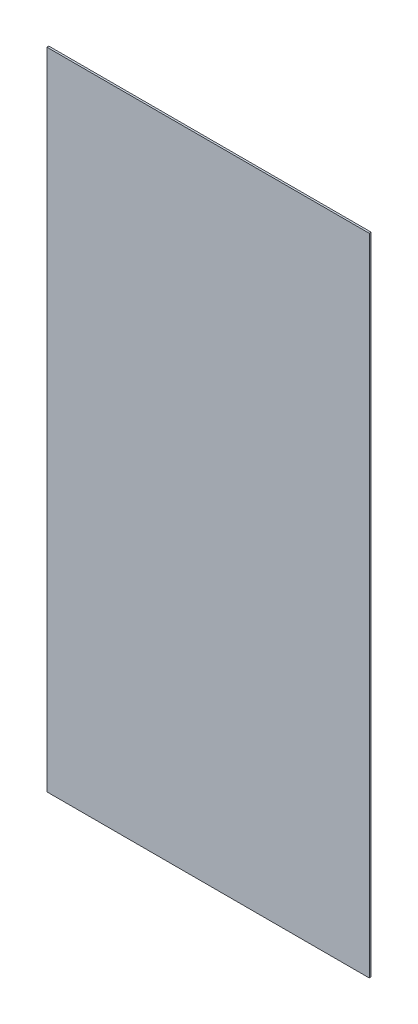
ISO-10303-21;
HEADER;
FILE_DESCRIPTION(('STEP AP214'),'2;1');
FILE_NAME('part.step','',(''),(''),'','','');
FILE_SCHEMA(('AUTOMOTIVE_DESIGN { 1 0 10303 214 1 1 1 1 }'));
ENDSEC;
DATA;
#1=APPLICATION_CONTEXT('core data for automotive mechanical design processes');
#2=APPLICATION_PROTOCOL_DEFINITION('international standard','automotive_design',2000,#1);
#3=PRODUCT_CONTEXT('',#1,'mechanical');
#4=PRODUCT('Part','Part','',(#3));
#5=PRODUCT_RELATED_PRODUCT_CATEGORY('part','',(#4));
#6=PRODUCT_DEFINITION_FORMATION('','',#4);
#7=PRODUCT_DEFINITION_CONTEXT('part definition',#1,'design');
#8=PRODUCT_DEFINITION('design','',#6,#7);
#9=PRODUCT_DEFINITION_SHAPE('','',#8);
#10=(LENGTH_UNIT() NAMED_UNIT(*) SI_UNIT(.MILLI.,.METRE.));
#11=(NAMED_UNIT(*) PLANE_ANGLE_UNIT() SI_UNIT($,.RADIAN.));
#12=(NAMED_UNIT(*) SI_UNIT($,.STERADIAN.) SOLID_ANGLE_UNIT());
#13=UNCERTAINTY_MEASURE_WITH_UNIT(LENGTH_MEASURE(1.E-05),#10,'distance_accuracy_value','');
#14=(GEOMETRIC_REPRESENTATION_CONTEXT(3) GLOBAL_UNCERTAINTY_ASSIGNED_CONTEXT((#13)) GLOBAL_UNIT_ASSIGNED_CONTEXT((#10,
#11,#12)) REPRESENTATION_CONTEXT('',''));
#15=CARTESIAN_POINT('',(0.,0.,0.));
#16=DIRECTION('',(0.,0.,1.));
#17=DIRECTION('',(1.,0.,0.));
#18=AXIS2_PLACEMENT_3D('',#15,#16,#17);
#19=CARTESIAN_POINT('',(250.,500.,3.));
#20=DIRECTION('',(-1.,0.,0.));
#21=DIRECTION('',(0.,-1.,0.));
#22=AXIS2_PLACEMENT_3D('',#19,#20,#21);
#23=PLANE('',#22);
#24=DIRECTION('',(0.,1.,0.));
#25=VECTOR('',#24,1.);
#26=CARTESIAN_POINT('',(250.,500.,0.));
#27=LINE('',#26,#25);
#28=CARTESIAN_POINT('',(250.,-500.,0.));
#29=VERTEX_POINT('',#28);
#30=CARTESIAN_POINT('',(250.,500.,0.));
#31=VERTEX_POINT('',#30);
#32=EDGE_CURVE('E106',#29,#31,#27,.T.);
#33=ORIENTED_EDGE('',*,*,#32,.T.);
#34=DIRECTION('',(0.,0.,-1.));
#35=VECTOR('',#34,1.);
#36=CARTESIAN_POINT('',(250.,500.,3.));
#37=LINE('',#36,#35);
#38=CARTESIAN_POINT('',(250.,500.,3.));
#39=VERTEX_POINT('',#38);
#40=EDGE_CURVE('E11',#39,#31,#37,.T.);
#41=ORIENTED_EDGE('',*,*,#40,.F.);
#42=DIRECTION('',(0.,1.,0.));
#43=VECTOR('',#42,1.);
#44=CARTESIAN_POINT('',(250.,500.,3.));
#45=LINE('',#44,#43);
#46=CARTESIAN_POINT('',(250.,-500.,3.));
#47=VERTEX_POINT('',#46);
#48=EDGE_CURVE('E94',#47,#39,#45,.T.);
#49=ORIENTED_EDGE('',*,*,#48,.F.);
#50=DIRECTION('',(0.,0.,-1.));
#51=VECTOR('',#50,1.);
#52=CARTESIAN_POINT('',(250.,-500.,3.));
#53=LINE('',#52,#51);
#54=EDGE_CURVE('E102',#47,#29,#53,.T.);
#55=ORIENTED_EDGE('',*,*,#54,.T.);
#56=EDGE_LOOP('',(#33,#41,#49,#55));
#57=FACE_BOUND('',#56,.T.);
#58=ADVANCED_FACE('F43',(#57),#23,.F.);
#59=CARTESIAN_POINT('',(-250.,500.,3.));
#60=DIRECTION('',(0.,-1.,0.));
#61=DIRECTION('',(1.,0.,0.));
#62=AXIS2_PLACEMENT_3D('',#59,#60,#61);
#63=PLANE('',#62);
#64=DIRECTION('',(-1.,0.,0.));
#65=VECTOR('',#64,1.);
#66=CARTESIAN_POINT('',(-250.,500.,0.));
#67=LINE('',#66,#65);
#68=CARTESIAN_POINT('',(-250.,500.,0.));
#69=VERTEX_POINT('',#68);
#70=EDGE_CURVE('E98',#31,#69,#67,.T.);
#71=ORIENTED_EDGE('',*,*,#70,.T.);
#72=DIRECTION('',(0.,0.,-1.));
#73=VECTOR('',#72,1.);
#74=CARTESIAN_POINT('',(-250.,500.,3.));
#75=LINE('',#74,#73);
#76=CARTESIAN_POINT('',(-250.,500.,3.));
#77=VERTEX_POINT('',#76);
#78=EDGE_CURVE('E51',#77,#69,#75,.T.);
#79=ORIENTED_EDGE('',*,*,#78,.F.);
#80=DIRECTION('',(-1.,0.,0.));
#81=VECTOR('',#80,1.);
#82=CARTESIAN_POINT('',(-250.,500.,3.));
#83=LINE('',#82,#81);
#84=EDGE_CURVE('E89',#39,#77,#83,.T.);
#85=ORIENTED_EDGE('',*,*,#84,.F.);
#86=ORIENTED_EDGE('',*,*,#40,.T.);
#87=EDGE_LOOP('',(#71,#79,#85,#86));
#88=FACE_BOUND('',#87,.T.);
#89=ADVANCED_FACE('F97',(#88),#63,.F.);
#90=CARTESIAN_POINT('',(-250.,500.,3.));
#91=DIRECTION('',(1.,0.,0.));
#92=DIRECTION('',(0.,1.,0.));
#93=AXIS2_PLACEMENT_3D('',#90,#91,#92);
#94=PLANE('',#93);
#95=DIRECTION('',(0.,-1.,0.));
#96=VECTOR('',#95,1.);
#97=CARTESIAN_POINT('',(-250.,500.,0.));
#98=LINE('',#97,#96);
#99=CARTESIAN_POINT('',(-250.,-500.,0.));
#100=VERTEX_POINT('',#99);
#101=EDGE_CURVE('E76',#69,#100,#98,.T.);
#102=ORIENTED_EDGE('',*,*,#101,.T.);
#103=DIRECTION('',(0.,0.,-1.));
#104=VECTOR('',#103,1.);
#105=CARTESIAN_POINT('',(-250.,-500.,3.));
#106=LINE('',#105,#104);
#107=CARTESIAN_POINT('',(-250.,-500.,3.));
#108=VERTEX_POINT('',#107);
#109=EDGE_CURVE('E99',#108,#100,#106,.T.);
#110=ORIENTED_EDGE('',*,*,#109,.F.);
#111=DIRECTION('',(0.,-1.,0.));
#112=VECTOR('',#111,1.);
#113=CARTESIAN_POINT('',(-250.,500.,3.));
#114=LINE('',#113,#112);
#115=EDGE_CURVE('E92',#77,#108,#114,.T.);
#116=ORIENTED_EDGE('',*,*,#115,.F.);
#117=ORIENTED_EDGE('',*,*,#78,.T.);
#118=EDGE_LOOP('',(#102,#110,#116,#117));
#119=FACE_BOUND('',#118,.T.);
#120=ADVANCED_FACE('F100',(#119),#94,.F.);
#121=CARTESIAN_POINT('',(-250.,-500.,3.));
#122=DIRECTION('',(0.,1.,0.));
#123=DIRECTION('',(0.,0.,1.));
#124=AXIS2_PLACEMENT_3D('',#121,#122,#123);
#125=PLANE('',#124);
#126=DIRECTION('',(1.,0.,0.));
#127=VECTOR('',#126,1.);
#128=CARTESIAN_POINT('',(-250.,-500.,0.));
#129=LINE('',#128,#127);
#130=EDGE_CURVE('E82',#100,#29,#129,.T.);
#131=ORIENTED_EDGE('',*,*,#130,.T.);
#132=ORIENTED_EDGE('',*,*,#54,.F.);
#133=DIRECTION('',(1.,0.,0.));
#134=VECTOR('',#133,1.);
#135=CARTESIAN_POINT('',(-250.,-500.,3.));
#136=LINE('',#135,#134);
#137=EDGE_CURVE('E59',#108,#47,#136,.T.);
#138=ORIENTED_EDGE('',*,*,#137,.F.);
#139=ORIENTED_EDGE('',*,*,#109,.T.);
#140=EDGE_LOOP('',(#131,#132,#138,#139));
#141=FACE_BOUND('',#140,.T.);
#142=ADVANCED_FACE('F113',(#141),#125,.F.);
#143=CARTESIAN_POINT('',(0.,0.,3.));
#144=DIRECTION('',(0.,0.,1.));
#145=DIRECTION('',(1.,0.,0.));
#146=AXIS2_PLACEMENT_3D('',#143,#144,#145);
#147=PLANE('',#146);
#148=ORIENTED_EDGE('',*,*,#48,.T.);
#149=ORIENTED_EDGE('',*,*,#84,.T.);
#150=ORIENTED_EDGE('',*,*,#115,.T.);
#151=ORIENTED_EDGE('',*,*,#137,.T.);
#152=EDGE_LOOP('',(#148,#149,#150,#151));
#153=FACE_BOUND('',#152,.T.);
#154=ADVANCED_FACE('F90',(#153),#147,.T.);
#155=CARTESIAN_POINT('',(0.,0.,0.));
#156=DIRECTION('',(0.,0.,1.));
#157=DIRECTION('',(1.,0.,0.));
#158=AXIS2_PLACEMENT_3D('',#155,#156,#157);
#159=PLANE('',#158);
#160=ORIENTED_EDGE('',*,*,#32,.F.);
#161=ORIENTED_EDGE('',*,*,#130,.F.);
#162=ORIENTED_EDGE('',*,*,#101,.F.);
#163=ORIENTED_EDGE('',*,*,#70,.F.);
#164=EDGE_LOOP('',(#160,#161,#162,#163));
#165=FACE_BOUND('',#164,.T.);
#166=ADVANCED_FACE('F116',(#165),#159,.F.);
#167=CLOSED_SHELL('',(#58,#89,#120,#142,#154,#166));
#168=MANIFOLD_SOLID_BREP('B2',#167);
#169=ADVANCED_BREP_SHAPE_REPRESENTATION('',(#18,#168),#14);
#170=SHAPE_DEFINITION_REPRESENTATION(#9,#169);
ENDSEC;
END-ISO-10303-21;
